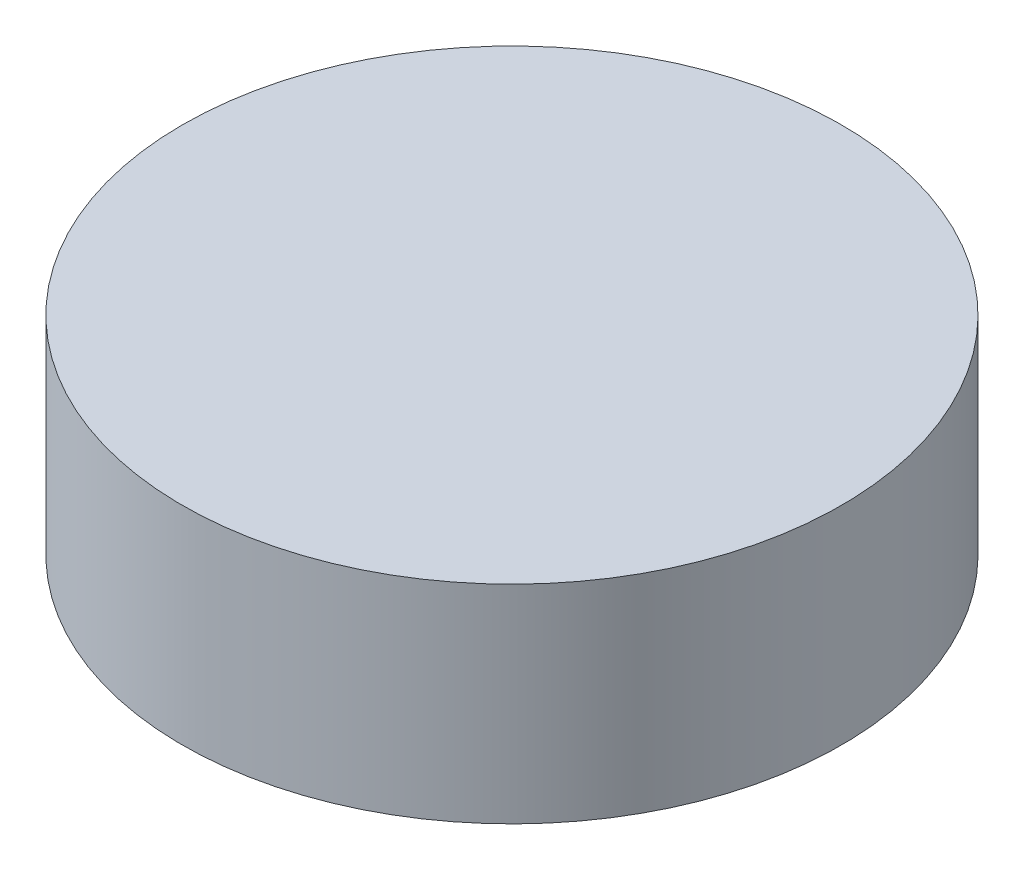
ISO-10303-21;
HEADER;
FILE_DESCRIPTION(('STEP AP214'),'2;1');
FILE_NAME('part.step','',(''),(''),'','','');
FILE_SCHEMA(('AUTOMOTIVE_DESIGN { 1 0 10303 214 1 1 1 1 }'));
ENDSEC;
DATA;
#1=APPLICATION_CONTEXT('core data for automotive mechanical design processes');
#2=APPLICATION_PROTOCOL_DEFINITION('international standard','automotive_design',2000,#1);
#3=PRODUCT_CONTEXT('',#1,'mechanical');
#4=PRODUCT('Part','Part','',(#3));
#5=PRODUCT_RELATED_PRODUCT_CATEGORY('part','',(#4));
#6=PRODUCT_DEFINITION_FORMATION('','',#4);
#7=PRODUCT_DEFINITION_CONTEXT('part definition',#1,'design');
#8=PRODUCT_DEFINITION('design','',#6,#7);
#9=PRODUCT_DEFINITION_SHAPE('','',#8);
#10=(LENGTH_UNIT() NAMED_UNIT(*) SI_UNIT(.MILLI.,.METRE.));
#11=(NAMED_UNIT(*) PLANE_ANGLE_UNIT() SI_UNIT($,.RADIAN.));
#12=(NAMED_UNIT(*) SI_UNIT($,.STERADIAN.) SOLID_ANGLE_UNIT());
#13=UNCERTAINTY_MEASURE_WITH_UNIT(LENGTH_MEASURE(1.E-05),#10,'distance_accuracy_value','');
#14=(GEOMETRIC_REPRESENTATION_CONTEXT(3) GLOBAL_UNCERTAINTY_ASSIGNED_CONTEXT((#13)) GLOBAL_UNIT_ASSIGNED_CONTEXT((#10,
#11,#12)) REPRESENTATION_CONTEXT('',''));
#15=CARTESIAN_POINT('',(0.,0.,0.));
#16=DIRECTION('',(0.,0.,1.));
#17=DIRECTION('',(1.,0.,0.));
#18=AXIS2_PLACEMENT_3D('',#15,#16,#17);
#19=CARTESIAN_POINT('',(0.,0.,0.));
#20=DIRECTION('',(0.,-1.,0.));
#21=DIRECTION('',(1.,0.,0.));
#22=AXIS2_PLACEMENT_3D('',#19,#20,#21);
#23=PLANE('',#22);
#24=CARTESIAN_POINT('',(0.,0.,0.));
#25=DIRECTION('',(0.,1.,0.));
#26=DIRECTION('',(-1.,0.,0.));
#27=AXIS2_PLACEMENT_3D('',#24,#25,#26);
#28=CIRCLE('',#27,6.35);
#29=CARTESIAN_POINT('',(-6.35,0.,0.));
#30=VERTEX_POINT('',#29);
#31=EDGE_CURVE('E10',#30,#30,#28,.T.);
#32=ORIENTED_EDGE('',*,*,#31,.F.);
#33=EDGE_LOOP('',(#32));
#34=FACE_BOUND('',#33,.T.);
#35=ADVANCED_FACE('F37',(#34),#23,.T.);
#36=CARTESIAN_POINT('',(0.,4.,0.));
#37=DIRECTION('',(0.,1.,0.));
#38=DIRECTION('',(-1.,0.,0.));
#39=AXIS2_PLACEMENT_3D('',#36,#37,#38);
#40=CYLINDRICAL_SURFACE('',#39,6.35);
#41=ORIENTED_EDGE('',*,*,#31,.T.);
#42=EDGE_LOOP('',(#41));
#43=FACE_BOUND('',#42,.T.);
#44=CARTESIAN_POINT('',(0.,4.,0.));
#45=DIRECTION('',(0.,1.,0.));
#46=DIRECTION('',(-1.,0.,0.));
#47=AXIS2_PLACEMENT_3D('',#44,#45,#46);
#48=CIRCLE('',#47,6.35);
#49=CARTESIAN_POINT('',(-6.35,4.,0.));
#50=VERTEX_POINT('',#49);
#51=EDGE_CURVE('E44',#50,#50,#48,.T.);
#52=ORIENTED_EDGE('',*,*,#51,.F.);
#53=EDGE_LOOP('',(#52));
#54=FACE_BOUND('',#53,.T.);
#55=ADVANCED_FACE('F53',(#43,#54),#40,.T.);
#56=CARTESIAN_POINT('',(-6.35,4.,0.));
#57=DIRECTION('',(0.,1.,0.));
#58=DIRECTION('',(-1.,0.,0.));
#59=AXIS2_PLACEMENT_3D('',#56,#57,#58);
#60=PLANE('',#59);
#61=ORIENTED_EDGE('',*,*,#51,.T.);
#62=EDGE_LOOP('',(#61));
#63=FACE_BOUND('',#62,.T.);
#64=ADVANCED_FACE('F51',(#63),#60,.T.);
#65=CLOSED_SHELL('',(#35,#55,#64));
#66=MANIFOLD_SOLID_BREP('B2',#65);
#67=ADVANCED_BREP_SHAPE_REPRESENTATION('',(#18,#66),#14);
#68=SHAPE_DEFINITION_REPRESENTATION(#9,#67);
ENDSEC;
END-ISO-10303-21;
